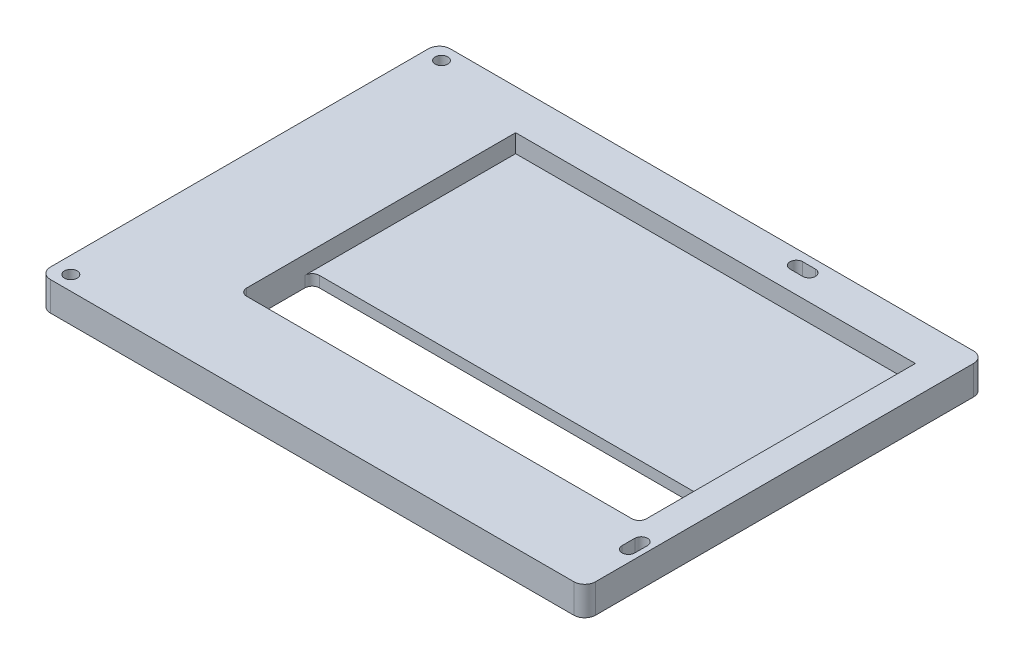
ISO-10303-21;
HEADER;
FILE_DESCRIPTION(('STEP AP214'),'2;1');
FILE_NAME('part.step','',(''),(''),'','','');
FILE_SCHEMA(('AUTOMOTIVE_DESIGN { 1 0 10303 214 1 1 1 1 }'));
ENDSEC;
DATA;
#1=APPLICATION_CONTEXT('core data for automotive mechanical design processes');
#2=APPLICATION_PROTOCOL_DEFINITION('international standard','automotive_design',2000,#1);
#3=PRODUCT_CONTEXT('',#1,'mechanical');
#4=PRODUCT('Part','Part','',(#3));
#5=PRODUCT_RELATED_PRODUCT_CATEGORY('part','',(#4));
#6=PRODUCT_DEFINITION_FORMATION('','',#4);
#7=PRODUCT_DEFINITION_CONTEXT('part definition',#1,'design');
#8=PRODUCT_DEFINITION('design','',#6,#7);
#9=PRODUCT_DEFINITION_SHAPE('','',#8);
#10=(LENGTH_UNIT() NAMED_UNIT(*) SI_UNIT(.MILLI.,.METRE.));
#11=(NAMED_UNIT(*) PLANE_ANGLE_UNIT() SI_UNIT($,.RADIAN.));
#12=(NAMED_UNIT(*) SI_UNIT($,.STERADIAN.) SOLID_ANGLE_UNIT());
#13=UNCERTAINTY_MEASURE_WITH_UNIT(LENGTH_MEASURE(1.E-05),#10,'distance_accuracy_value','');
#14=(GEOMETRIC_REPRESENTATION_CONTEXT(3) GLOBAL_UNCERTAINTY_ASSIGNED_CONTEXT((#13)) GLOBAL_UNIT_ASSIGNED_CONTEXT((#10,
#11,#12)) REPRESENTATION_CONTEXT('',''));
#15=CARTESIAN_POINT('',(0.,0.,0.));
#16=DIRECTION('',(0.,0.,1.));
#17=DIRECTION('',(1.,0.,0.));
#18=AXIS2_PLACEMENT_3D('',#15,#16,#17);
#19=CARTESIAN_POINT('',(0.,8.,0.));
#20=DIRECTION('',(1.,0.,0.));
#21=DIRECTION('',(0.,0.,-1.));
#22=AXIS2_PLACEMENT_3D('',#19,#20,#21);
#23=PLANE('',#22);
#24=DIRECTION('',(0.,0.,1.));
#25=VECTOR('',#24,1.);
#26=CARTESIAN_POINT('',(0.,8.,0.));
#27=LINE('',#26,#25);
#28=CARTESIAN_POINT('',(0.,8.,-107.));
#29=VERTEX_POINT('',#28);
#30=CARTESIAN_POINT('',(0.,8.,-3.));
#31=VERTEX_POINT('',#30);
#32=EDGE_CURVE('E387',#29,#31,#27,.T.);
#33=ORIENTED_EDGE('',*,*,#32,.F.);
#34=DIRECTION('',(0.,-1.,0.));
#35=VECTOR('',#34,1.);
#36=CARTESIAN_POINT('',(0.,8.,-107.));
#37=LINE('',#36,#35);
#38=CARTESIAN_POINT('',(0.,0.,-107.));
#39=VERTEX_POINT('',#38);
#40=EDGE_CURVE('E468',#29,#39,#37,.T.);
#41=ORIENTED_EDGE('',*,*,#40,.T.);
#42=DIRECTION('',(0.,0.,1.));
#43=VECTOR('',#42,1.);
#44=CARTESIAN_POINT('',(0.,0.,0.));
#45=LINE('',#44,#43);
#46=CARTESIAN_POINT('',(0.,0.,-3.));
#47=VERTEX_POINT('',#46);
#48=EDGE_CURVE('E383',#39,#47,#45,.T.);
#49=ORIENTED_EDGE('',*,*,#48,.T.);
#50=DIRECTION('',(0.,-1.,0.));
#51=VECTOR('',#50,1.);
#52=CARTESIAN_POINT('',(0.,8.,-3.));
#53=LINE('',#52,#51);
#54=EDGE_CURVE('E465',#47,#31,#53,.F.);
#55=ORIENTED_EDGE('',*,*,#54,.T.);
#56=EDGE_LOOP('',(#33,#41,#49,#55));
#57=FACE_BOUND('',#56,.T.);
#58=ADVANCED_FACE('F39',(#57),#23,.F.);
#59=CARTESIAN_POINT('',(0.,8.,0.));
#60=DIRECTION('',(0.,0.,-1.));
#61=DIRECTION('',(-1.,0.,0.));
#62=AXIS2_PLACEMENT_3D('',#59,#60,#61);
#63=PLANE('',#62);
#64=DIRECTION('',(1.,0.,0.));
#65=VECTOR('',#64,1.);
#66=CARTESIAN_POINT('',(0.,0.,0.));
#67=LINE('',#66,#65);
#68=CARTESIAN_POINT('',(3.,0.,0.));
#69=VERTEX_POINT('',#68);
#70=CARTESIAN_POINT('',(147.,0.,0.));
#71=VERTEX_POINT('',#70);
#72=EDGE_CURVE('E406',#69,#71,#67,.T.);
#73=ORIENTED_EDGE('',*,*,#72,.T.);
#74=DIRECTION('',(0.,-1.,0.));
#75=VECTOR('',#74,1.);
#76=CARTESIAN_POINT('',(147.,8.,0.));
#77=LINE('',#76,#75);
#78=CARTESIAN_POINT('',(147.,8.,0.));
#79=VERTEX_POINT('',#78);
#80=EDGE_CURVE('E11',#71,#79,#77,.F.);
#81=ORIENTED_EDGE('',*,*,#80,.T.);
#82=DIRECTION('',(1.,0.,0.));
#83=VECTOR('',#82,1.);
#84=CARTESIAN_POINT('',(0.,8.,0.));
#85=LINE('',#84,#83);
#86=CARTESIAN_POINT('',(3.,8.,0.));
#87=VERTEX_POINT('',#86);
#88=EDGE_CURVE('E391',#87,#79,#85,.T.);
#89=ORIENTED_EDGE('',*,*,#88,.F.);
#90=DIRECTION('',(0.,-1.,0.));
#91=VECTOR('',#90,1.);
#92=CARTESIAN_POINT('',(3.,8.,0.));
#93=LINE('',#92,#91);
#94=EDGE_CURVE('E48',#87,#69,#93,.T.);
#95=ORIENTED_EDGE('',*,*,#94,.T.);
#96=EDGE_LOOP('',(#73,#81,#89,#95));
#97=FACE_BOUND('',#96,.T.);
#98=ADVANCED_FACE('F513',(#97),#63,.F.);
#99=CARTESIAN_POINT('',(150.,8.,0.));
#100=DIRECTION('',(-1.,0.,0.));
#101=DIRECTION('',(0.,0.,1.));
#102=AXIS2_PLACEMENT_3D('',#99,#100,#101);
#103=PLANE('',#102);
#104=DIRECTION('',(0.,0.,-1.));
#105=VECTOR('',#104,1.);
#106=CARTESIAN_POINT('',(150.,0.,0.));
#107=LINE('',#106,#105);
#108=CARTESIAN_POINT('',(150.,0.,-3.));
#109=VERTEX_POINT('',#108);
#110=CARTESIAN_POINT('',(150.,0.,-107.));
#111=VERTEX_POINT('',#110);
#112=EDGE_CURVE('E410',#109,#111,#107,.T.);
#113=ORIENTED_EDGE('',*,*,#112,.T.);
#114=DIRECTION('',(0.,-1.,0.));
#115=VECTOR('',#114,1.);
#116=CARTESIAN_POINT('',(150.,8.,-107.));
#117=LINE('',#116,#115);
#118=CARTESIAN_POINT('',(150.,8.,-107.));
#119=VERTEX_POINT('',#118);
#120=EDGE_CURVE('E55',#111,#119,#117,.F.);
#121=ORIENTED_EDGE('',*,*,#120,.T.);
#122=DIRECTION('',(0.,0.,-1.));
#123=VECTOR('',#122,1.);
#124=CARTESIAN_POINT('',(150.,8.,0.));
#125=LINE('',#124,#123);
#126=CARTESIAN_POINT('',(150.,8.,-3.));
#127=VERTEX_POINT('',#126);
#128=EDGE_CURVE('E395',#127,#119,#125,.T.);
#129=ORIENTED_EDGE('',*,*,#128,.F.);
#130=DIRECTION('',(0.,-1.,0.));
#131=VECTOR('',#130,1.);
#132=CARTESIAN_POINT('',(150.,8.,-3.));
#133=LINE('',#132,#131);
#134=EDGE_CURVE('E502',#127,#109,#133,.T.);
#135=ORIENTED_EDGE('',*,*,#134,.T.);
#136=EDGE_LOOP('',(#113,#121,#129,#135));
#137=FACE_BOUND('',#136,.T.);
#138=ADVANCED_FACE('F524',(#137),#103,.F.);
#139=CARTESIAN_POINT('',(0.,8.,-110.));
#140=DIRECTION('',(0.,0.,1.));
#141=DIRECTION('',(1.,0.,0.));
#142=AXIS2_PLACEMENT_3D('',#139,#140,#141);
#143=PLANE('',#142);
#144=DIRECTION('',(-1.,0.,0.));
#145=VECTOR('',#144,1.);
#146=CARTESIAN_POINT('',(0.,0.,-110.));
#147=LINE('',#146,#145);
#148=CARTESIAN_POINT('',(147.,0.,-110.));
#149=VERTEX_POINT('',#148);
#150=CARTESIAN_POINT('',(3.,0.,-110.));
#151=VERTEX_POINT('',#150);
#152=EDGE_CURVE('E392',#149,#151,#147,.T.);
#153=ORIENTED_EDGE('',*,*,#152,.T.);
#154=DIRECTION('',(0.,-1.,0.));
#155=VECTOR('',#154,1.);
#156=CARTESIAN_POINT('',(3.,8.,-110.));
#157=LINE('',#156,#155);
#158=CARTESIAN_POINT('',(3.,8.,-110.));
#159=VERTEX_POINT('',#158);
#160=EDGE_CURVE('E488',#151,#159,#157,.F.);
#161=ORIENTED_EDGE('',*,*,#160,.T.);
#162=DIRECTION('',(-1.,0.,0.));
#163=VECTOR('',#162,1.);
#164=CARTESIAN_POINT('',(0.,8.,-110.));
#165=LINE('',#164,#163);
#166=CARTESIAN_POINT('',(147.,8.,-110.));
#167=VERTEX_POINT('',#166);
#168=EDGE_CURVE('E398',#167,#159,#165,.T.);
#169=ORIENTED_EDGE('',*,*,#168,.F.);
#170=DIRECTION('',(0.,-1.,0.));
#171=VECTOR('',#170,1.);
#172=CARTESIAN_POINT('',(147.,8.,-110.));
#173=LINE('',#172,#171);
#174=EDGE_CURVE('E484',#167,#149,#173,.T.);
#175=ORIENTED_EDGE('',*,*,#174,.T.);
#176=EDGE_LOOP('',(#153,#161,#169,#175));
#177=FACE_BOUND('',#176,.T.);
#178=ADVANCED_FACE('F533',(#177),#143,.F.);
#179=CARTESIAN_POINT('',(0.,8.,0.));
#180=DIRECTION('',(0.,-1.,0.));
#181=DIRECTION('',(0.,0.,-1.));
#182=AXIS2_PLACEMENT_3D('',#179,#180,#181);
#183=PLANE('',#182);
#184=DIRECTION('',(0.,0.,1.));
#185=VECTOR('',#184,1.);
#186=CARTESIAN_POINT('',(32.,8.,-43.));
#187=LINE('',#186,#185);
#188=CARTESIAN_POINT('',(32.,8.,-99.));
#189=VERTEX_POINT('',#188);
#190=CARTESIAN_POINT('',(32.,8.,-25.));
#191=VERTEX_POINT('',#190);
#192=EDGE_CURVE('E254',#189,#191,#187,.T.);
#193=ORIENTED_EDGE('',*,*,#192,.F.);
#194=DIRECTION('',(-1.,0.,0.));
#195=VECTOR('',#194,1.);
#196=CARTESIAN_POINT('',(32.,8.,-99.));
#197=LINE('',#196,#195);
#198=CARTESIAN_POINT('',(142.,8.,-99.));
#199=VERTEX_POINT('',#198);
#200=EDGE_CURVE('E245',#199,#189,#197,.T.);
#201=ORIENTED_EDGE('',*,*,#200,.F.);
#202=DIRECTION('',(0.,0.,-1.));
#203=VECTOR('',#202,1.);
#204=CARTESIAN_POINT('',(142.,8.,-43.));
#205=LINE('',#204,#203);
#206=CARTESIAN_POINT('',(142.,8.,-25.));
#207=VERTEX_POINT('',#206);
#208=EDGE_CURVE('E231',#207,#199,#205,.T.);
#209=ORIENTED_EDGE('',*,*,#208,.F.);
#210=CARTESIAN_POINT('',(140.,8.,-25.));
#211=DIRECTION('',(0.,-1.,0.));
#212=DIRECTION('',(0.,0.,-1.));
#213=AXIS2_PLACEMENT_3D('',#210,#211,#212);
#214=CIRCLE('',#213,2.);
#215=CARTESIAN_POINT('',(140.,8.,-23.));
#216=VERTEX_POINT('',#215);
#217=EDGE_CURVE('E453',#207,#216,#214,.T.);
#218=ORIENTED_EDGE('',*,*,#217,.T.);
#219=DIRECTION('',(1.,0.,0.));
#220=VECTOR('',#219,1.);
#221=CARTESIAN_POINT('',(32.,8.,-23.));
#222=LINE('',#221,#220);
#223=CARTESIAN_POINT('',(34.,8.,-23.));
#224=VERTEX_POINT('',#223);
#225=EDGE_CURVE('E275',#224,#216,#222,.T.);
#226=ORIENTED_EDGE('',*,*,#225,.F.);
#227=CARTESIAN_POINT('',(34.,8.,-25.));
#228=DIRECTION('',(0.,-1.,0.));
#229=DIRECTION('',(0.,0.,-1.));
#230=AXIS2_PLACEMENT_3D('',#227,#228,#229);
#231=CIRCLE('',#230,2.);
#232=EDGE_CURVE('E459',#224,#191,#231,.T.);
#233=ORIENTED_EDGE('',*,*,#232,.T.);
#234=EDGE_LOOP('',(#193,#201,#209,#218,#226,#233));
#235=FACE_BOUND('',#234,.T.);
#236=DIRECTION('',(0.,0.,-1.));
#237=VECTOR('',#236,1.);
#238=CARTESIAN_POINT('',(148.55,8.,-15.25));
#239=LINE('',#238,#237);
#240=CARTESIAN_POINT('',(148.55,8.,-15.25));
#241=VERTEX_POINT('',#240);
#242=CARTESIAN_POINT('',(148.55,8.,-18.75));
#243=VERTEX_POINT('',#242);
#244=EDGE_CURVE('E349',#241,#243,#239,.T.);
#245=ORIENTED_EDGE('',*,*,#244,.F.);
#246=CARTESIAN_POINT('',(146.8,8.,-15.25));
#247=DIRECTION('',(0.,1.,0.));
#248=DIRECTION('',(0.,0.,1.));
#249=AXIS2_PLACEMENT_3D('',#246,#247,#248);
#250=CIRCLE('',#249,1.75);
#251=CARTESIAN_POINT('',(145.05,8.,-15.25));
#252=VERTEX_POINT('',#251);
#253=EDGE_CURVE('E271',#252,#241,#250,.T.);
#254=ORIENTED_EDGE('',*,*,#253,.F.);
#255=DIRECTION('',(0.,0.,1.));
#256=VECTOR('',#255,1.);
#257=CARTESIAN_POINT('',(145.05,8.,-15.25));
#258=LINE('',#257,#256);
#259=CARTESIAN_POINT('',(145.05,8.,-18.75));
#260=VERTEX_POINT('',#259);
#261=EDGE_CURVE('E333',#260,#252,#258,.T.);
#262=ORIENTED_EDGE('',*,*,#261,.F.);
#263=CARTESIAN_POINT('',(146.8,8.,-18.75));
#264=DIRECTION('',(0.,1.,0.));
#265=DIRECTION('',(0.,0.,1.));
#266=AXIS2_PLACEMENT_3D('',#263,#264,#265);
#267=CIRCLE('',#266,1.75);
#268=EDGE_CURVE('E352',#243,#260,#267,.T.);
#269=ORIENTED_EDGE('',*,*,#268,.F.);
#270=EDGE_LOOP('',(#245,#254,#262,#269));
#271=FACE_BOUND('',#270,.T.);
#272=DIRECTION('',(1.,0.,0.));
#273=VECTOR('',#272,1.);
#274=CARTESIAN_POINT('',(102.25,8.,-104.25));
#275=LINE('',#274,#273);
#276=CARTESIAN_POINT('',(102.25,8.,-104.25));
#277=VERTEX_POINT('',#276);
#278=CARTESIAN_POINT('',(105.75,8.,-104.25));
#279=VERTEX_POINT('',#278);
#280=EDGE_CURVE('E302',#277,#279,#275,.T.);
#281=ORIENTED_EDGE('',*,*,#280,.F.);
#282=CARTESIAN_POINT('',(102.25,8.,-106.));
#283=DIRECTION('',(0.,1.,0.));
#284=DIRECTION('',(0.,0.,1.));
#285=AXIS2_PLACEMENT_3D('',#282,#283,#284);
#286=CIRCLE('',#285,1.75);
#287=CARTESIAN_POINT('',(102.25,8.,-107.75));
#288=VERTEX_POINT('',#287);
#289=EDGE_CURVE('E299',#288,#277,#286,.T.);
#290=ORIENTED_EDGE('',*,*,#289,.F.);
#291=DIRECTION('',(-1.,0.,0.));
#292=VECTOR('',#291,1.);
#293=CARTESIAN_POINT('',(102.25,8.,-107.75));
#294=LINE('',#293,#292);
#295=CARTESIAN_POINT('',(105.75,8.,-107.75));
#296=VERTEX_POINT('',#295);
#297=EDGE_CURVE('E286',#296,#288,#294,.T.);
#298=ORIENTED_EDGE('',*,*,#297,.F.);
#299=CARTESIAN_POINT('',(105.75,8.,-106.));
#300=DIRECTION('',(0.,1.,0.));
#301=DIRECTION('',(0.,0.,1.));
#302=AXIS2_PLACEMENT_3D('',#299,#300,#301);
#303=CIRCLE('',#302,1.75);
#304=EDGE_CURVE('E306',#279,#296,#303,.T.);
#305=ORIENTED_EDGE('',*,*,#304,.F.);
#306=EDGE_LOOP('',(#281,#290,#298,#305));
#307=FACE_BOUND('',#306,.T.);
#308=CARTESIAN_POINT('',(4.6,8.,-4.));
#309=DIRECTION('',(0.,1.,0.));
#310=DIRECTION('',(0.,0.,1.));
#311=AXIS2_PLACEMENT_3D('',#308,#309,#310);
#312=CIRCLE('',#311,1.75);
#313=CARTESIAN_POINT('',(4.6,8.,-2.25));
#314=VERTEX_POINT('',#313);
#315=EDGE_CURVE('E316',#314,#314,#312,.T.);
#316=ORIENTED_EDGE('',*,*,#315,.F.);
#317=EDGE_LOOP('',(#316));
#318=FACE_BOUND('',#317,.T.);
#319=CARTESIAN_POINT('',(4.6,8.,-106.));
#320=DIRECTION('',(0.,1.,0.));
#321=DIRECTION('',(0.,0.,1.));
#322=AXIS2_PLACEMENT_3D('',#319,#320,#321);
#323=CIRCLE('',#322,1.75);
#324=CARTESIAN_POINT('',(4.6,8.,-104.25));
#325=VERTEX_POINT('',#324);
#326=EDGE_CURVE('E375',#325,#325,#323,.T.);
#327=ORIENTED_EDGE('',*,*,#326,.F.);
#328=EDGE_LOOP('',(#327));
#329=FACE_BOUND('',#328,.T.);
#330=ORIENTED_EDGE('',*,*,#168,.T.);
#331=CARTESIAN_POINT('',(3.,8.,-107.));
#332=DIRECTION('',(0.,-1.,0.));
#333=DIRECTION('',(0.,0.,-1.));
#334=AXIS2_PLACEMENT_3D('',#331,#332,#333);
#335=CIRCLE('',#334,3.);
#336=EDGE_CURVE('E499',#159,#29,#335,.F.);
#337=ORIENTED_EDGE('',*,*,#336,.T.);
#338=ORIENTED_EDGE('',*,*,#32,.T.);
#339=CARTESIAN_POINT('',(3.,8.,-3.));
#340=DIRECTION('',(0.,-1.,0.));
#341=DIRECTION('',(0.,0.,-1.));
#342=AXIS2_PLACEMENT_3D('',#339,#340,#341);
#343=CIRCLE('',#342,3.);
#344=EDGE_CURVE('E491',#31,#87,#343,.F.);
#345=ORIENTED_EDGE('',*,*,#344,.T.);
#346=ORIENTED_EDGE('',*,*,#88,.T.);
#347=CARTESIAN_POINT('',(147.,8.,-3.));
#348=DIRECTION('',(0.,-1.,0.));
#349=DIRECTION('',(0.,0.,-1.));
#350=AXIS2_PLACEMENT_3D('',#347,#348,#349);
#351=CIRCLE('',#350,3.);
#352=EDGE_CURVE('E62',#79,#127,#351,.F.);
#353=ORIENTED_EDGE('',*,*,#352,.T.);
#354=ORIENTED_EDGE('',*,*,#128,.T.);
#355=CARTESIAN_POINT('',(147.,8.,-107.));
#356=DIRECTION('',(0.,-1.,0.));
#357=DIRECTION('',(0.,0.,-1.));
#358=AXIS2_PLACEMENT_3D('',#355,#356,#357);
#359=CIRCLE('',#358,3.);
#360=EDGE_CURVE('E496',#119,#167,#359,.F.);
#361=ORIENTED_EDGE('',*,*,#360,.T.);
#362=EDGE_LOOP('',(#330,#337,#338,#345,#346,#353,#354,#361));
#363=FACE_BOUND('',#362,.T.);
#364=ADVANCED_FACE('F526',(#235,#271,#307,#318,#329,#363),#183,.F.);
#365=CARTESIAN_POINT('',(0.,0.,0.));
#366=DIRECTION('',(0.,-1.,0.));
#367=DIRECTION('',(0.,0.,-1.));
#368=AXIS2_PLACEMENT_3D('',#365,#366,#367);
#369=PLANE('',#368);
#370=DIRECTION('',(-1.,0.,0.));
#371=VECTOR('',#370,1.);
#372=CARTESIAN_POINT('',(32.,0.,-43.));
#373=LINE('',#372,#371);
#374=CARTESIAN_POINT('',(140.,0.,-43.));
#375=VERTEX_POINT('',#374);
#376=CARTESIAN_POINT('',(34.,0.,-43.));
#377=VERTEX_POINT('',#376);
#378=EDGE_CURVE('E267',#375,#377,#373,.T.);
#379=ORIENTED_EDGE('',*,*,#378,.T.);
#380=CARTESIAN_POINT('',(34.,0.,-41.));
#381=DIRECTION('',(0.,-1.,0.));
#382=DIRECTION('',(0.,0.,-1.));
#383=AXIS2_PLACEMENT_3D('',#380,#381,#382);
#384=CIRCLE('',#383,2.);
#385=CARTESIAN_POINT('',(32.,0.,-41.));
#386=VERTEX_POINT('',#385);
#387=EDGE_CURVE('E450',#377,#386,#384,.F.);
#388=ORIENTED_EDGE('',*,*,#387,.T.);
#389=DIRECTION('',(0.,0.,1.));
#390=VECTOR('',#389,1.);
#391=CARTESIAN_POINT('',(32.,0.,-43.));
#392=LINE('',#391,#390);
#393=CARTESIAN_POINT('',(32.,0.,-25.));
#394=VERTEX_POINT('',#393);
#395=EDGE_CURVE('E255',#386,#394,#392,.T.);
#396=ORIENTED_EDGE('',*,*,#395,.T.);
#397=CARTESIAN_POINT('',(34.,0.,-25.));
#398=DIRECTION('',(0.,-1.,0.));
#399=DIRECTION('',(0.,0.,-1.));
#400=AXIS2_PLACEMENT_3D('',#397,#398,#399);
#401=CIRCLE('',#400,2.);
#402=CARTESIAN_POINT('',(34.,0.,-23.));
#403=VERTEX_POINT('',#402);
#404=EDGE_CURVE('E462',#394,#403,#401,.F.);
#405=ORIENTED_EDGE('',*,*,#404,.T.);
#406=DIRECTION('',(1.,0.,0.));
#407=VECTOR('',#406,1.);
#408=CARTESIAN_POINT('',(32.,0.,-23.));
#409=LINE('',#408,#407);
#410=CARTESIAN_POINT('',(140.,0.,-23.));
#411=VERTEX_POINT('',#410);
#412=EDGE_CURVE('E259',#403,#411,#409,.T.);
#413=ORIENTED_EDGE('',*,*,#412,.T.);
#414=CARTESIAN_POINT('',(140.,0.,-25.));
#415=DIRECTION('',(0.,-1.,0.));
#416=DIRECTION('',(0.,0.,-1.));
#417=AXIS2_PLACEMENT_3D('',#414,#415,#416);
#418=CIRCLE('',#417,2.);
#419=CARTESIAN_POINT('',(142.,0.,-25.));
#420=VERTEX_POINT('',#419);
#421=EDGE_CURVE('E456',#411,#420,#418,.F.);
#422=ORIENTED_EDGE('',*,*,#421,.T.);
#423=DIRECTION('',(0.,0.,-1.));
#424=VECTOR('',#423,1.);
#425=CARTESIAN_POINT('',(142.,0.,-43.));
#426=LINE('',#425,#424);
#427=CARTESIAN_POINT('',(142.,0.,-41.));
#428=VERTEX_POINT('',#427);
#429=EDGE_CURVE('E263',#420,#428,#426,.T.);
#430=ORIENTED_EDGE('',*,*,#429,.T.);
#431=CARTESIAN_POINT('',(140.,0.,-41.));
#432=DIRECTION('',(0.,-1.,0.));
#433=DIRECTION('',(0.,0.,-1.));
#434=AXIS2_PLACEMENT_3D('',#431,#432,#433);
#435=CIRCLE('',#434,2.);
#436=EDGE_CURVE('E444',#428,#375,#435,.F.);
#437=ORIENTED_EDGE('',*,*,#436,.T.);
#438=EDGE_LOOP('',(#379,#388,#396,#405,#413,#422,#430,#437));
#439=FACE_BOUND('',#438,.T.);
#440=CARTESIAN_POINT('',(102.25,0.,-106.));
#441=DIRECTION('',(0.,1.,0.));
#442=DIRECTION('',(0.,0.,1.));
#443=AXIS2_PLACEMENT_3D('',#440,#441,#442);
#444=CIRCLE('',#443,1.75);
#445=CARTESIAN_POINT('',(102.25,0.,-107.75));
#446=VERTEX_POINT('',#445);
#447=CARTESIAN_POINT('',(102.25,0.,-104.25));
#448=VERTEX_POINT('',#447);
#449=EDGE_CURVE('E281',#446,#448,#444,.T.);
#450=ORIENTED_EDGE('',*,*,#449,.T.);
#451=DIRECTION('',(1.,0.,0.));
#452=VECTOR('',#451,1.);
#453=CARTESIAN_POINT('',(102.25,0.,-104.25));
#454=LINE('',#453,#452);
#455=CARTESIAN_POINT('',(105.75,0.,-104.25));
#456=VERTEX_POINT('',#455);
#457=EDGE_CURVE('E285',#448,#456,#454,.T.);
#458=ORIENTED_EDGE('',*,*,#457,.T.);
#459=CARTESIAN_POINT('',(105.75,0.,-106.));
#460=DIRECTION('',(0.,1.,0.));
#461=DIRECTION('',(0.,0.,1.));
#462=AXIS2_PLACEMENT_3D('',#459,#460,#461);
#463=CIRCLE('',#462,1.75);
#464=CARTESIAN_POINT('',(105.75,0.,-107.75));
#465=VERTEX_POINT('',#464);
#466=EDGE_CURVE('E290',#456,#465,#463,.T.);
#467=ORIENTED_EDGE('',*,*,#466,.T.);
#468=DIRECTION('',(-1.,0.,0.));
#469=VECTOR('',#468,1.);
#470=CARTESIAN_POINT('',(102.25,0.,-107.75));
#471=LINE('',#470,#469);
#472=EDGE_CURVE('E294',#465,#446,#471,.T.);
#473=ORIENTED_EDGE('',*,*,#472,.T.);
#474=EDGE_LOOP('',(#450,#458,#467,#473));
#475=FACE_BOUND('',#474,.T.);
#476=CARTESIAN_POINT('',(146.8,0.,-15.25));
#477=DIRECTION('',(0.,1.,0.));
#478=DIRECTION('',(0.,0.,1.));
#479=AXIS2_PLACEMENT_3D('',#476,#477,#478);
#480=CIRCLE('',#479,1.75);
#481=CARTESIAN_POINT('',(145.05,0.,-15.25));
#482=VERTEX_POINT('',#481);
#483=CARTESIAN_POINT('',(148.55,0.,-15.25));
#484=VERTEX_POINT('',#483);
#485=EDGE_CURVE('E328',#482,#484,#480,.T.);
#486=ORIENTED_EDGE('',*,*,#485,.T.);
#487=DIRECTION('',(0.,0.,-1.));
#488=VECTOR('',#487,1.);
#489=CARTESIAN_POINT('',(148.55,0.,-15.25));
#490=LINE('',#489,#488);
#491=CARTESIAN_POINT('',(148.55,0.,-18.75));
#492=VERTEX_POINT('',#491);
#493=EDGE_CURVE('E332',#484,#492,#490,.T.);
#494=ORIENTED_EDGE('',*,*,#493,.T.);
#495=CARTESIAN_POINT('',(146.8,0.,-18.75));
#496=DIRECTION('',(0.,1.,0.));
#497=DIRECTION('',(0.,0.,1.));
#498=AXIS2_PLACEMENT_3D('',#495,#496,#497);
#499=CIRCLE('',#498,1.75);
#500=CARTESIAN_POINT('',(145.05,0.,-18.75));
#501=VERTEX_POINT('',#500);
#502=EDGE_CURVE('E337',#492,#501,#499,.T.);
#503=ORIENTED_EDGE('',*,*,#502,.T.);
#504=DIRECTION('',(0.,0.,1.));
#505=VECTOR('',#504,1.);
#506=CARTESIAN_POINT('',(145.05,0.,-15.25));
#507=LINE('',#506,#505);
#508=EDGE_CURVE('E341',#501,#482,#507,.T.);
#509=ORIENTED_EDGE('',*,*,#508,.T.);
#510=EDGE_LOOP('',(#486,#494,#503,#509));
#511=FACE_BOUND('',#510,.T.);
#512=CARTESIAN_POINT('',(4.6,0.,-4.));
#513=DIRECTION('',(0.,1.,0.));
#514=DIRECTION('',(0.,0.,1.));
#515=AXIS2_PLACEMENT_3D('',#512,#513,#514);
#516=CIRCLE('',#515,1.75);
#517=CARTESIAN_POINT('',(4.6,0.,-2.25));
#518=VERTEX_POINT('',#517);
#519=EDGE_CURVE('E371',#518,#518,#516,.T.);
#520=ORIENTED_EDGE('',*,*,#519,.T.);
#521=EDGE_LOOP('',(#520));
#522=FACE_BOUND('',#521,.T.);
#523=CARTESIAN_POINT('',(4.6,0.,-106.));
#524=DIRECTION('',(0.,1.,0.));
#525=DIRECTION('',(0.,0.,1.));
#526=AXIS2_PLACEMENT_3D('',#523,#524,#525);
#527=CIRCLE('',#526,1.75);
#528=CARTESIAN_POINT('',(4.6,0.,-104.25));
#529=VERTEX_POINT('',#528);
#530=EDGE_CURVE('E379',#529,#529,#527,.T.);
#531=ORIENTED_EDGE('',*,*,#530,.T.);
#532=EDGE_LOOP('',(#531));
#533=FACE_BOUND('',#532,.T.);
#534=ORIENTED_EDGE('',*,*,#48,.F.);
#535=CARTESIAN_POINT('',(3.,0.,-107.));
#536=DIRECTION('',(0.,-1.,0.));
#537=DIRECTION('',(0.,0.,-1.));
#538=AXIS2_PLACEMENT_3D('',#535,#536,#537);
#539=CIRCLE('',#538,3.);
#540=EDGE_CURVE('E481',#39,#151,#539,.T.);
#541=ORIENTED_EDGE('',*,*,#540,.T.);
#542=ORIENTED_EDGE('',*,*,#152,.F.);
#543=CARTESIAN_POINT('',(147.,0.,-107.));
#544=DIRECTION('',(0.,-1.,0.));
#545=DIRECTION('',(0.,0.,-1.));
#546=AXIS2_PLACEMENT_3D('',#543,#544,#545);
#547=CIRCLE('',#546,3.);
#548=EDGE_CURVE('E478',#149,#111,#547,.T.);
#549=ORIENTED_EDGE('',*,*,#548,.T.);
#550=ORIENTED_EDGE('',*,*,#112,.F.);
#551=CARTESIAN_POINT('',(147.,0.,-3.));
#552=DIRECTION('',(0.,-1.,0.));
#553=DIRECTION('',(0.,0.,-1.));
#554=AXIS2_PLACEMENT_3D('',#551,#552,#553);
#555=CIRCLE('',#554,3.);
#556=EDGE_CURVE('E475',#109,#71,#555,.T.);
#557=ORIENTED_EDGE('',*,*,#556,.T.);
#558=ORIENTED_EDGE('',*,*,#72,.F.);
#559=CARTESIAN_POINT('',(3.,0.,-3.));
#560=DIRECTION('',(0.,-1.,0.));
#561=DIRECTION('',(0.,0.,-1.));
#562=AXIS2_PLACEMENT_3D('',#559,#560,#561);
#563=CIRCLE('',#562,3.);
#564=EDGE_CURVE('E472',#69,#47,#563,.T.);
#565=ORIENTED_EDGE('',*,*,#564,.T.);
#566=EDGE_LOOP('',(#534,#541,#542,#549,#550,#557,#558,#565));
#567=FACE_BOUND('',#566,.T.);
#568=ADVANCED_FACE('F519',(#439,#475,#511,#522,#533,#567),#369,.T.);
#569=CARTESIAN_POINT('',(4.6,0.,-106.));
#570=DIRECTION('',(0.,1.,0.));
#571=DIRECTION('',(0.,0.,1.));
#572=AXIS2_PLACEMENT_3D('',#569,#570,#571);
#573=CYLINDRICAL_SURFACE('',#572,1.75);
#574=ORIENTED_EDGE('',*,*,#530,.F.);
#575=EDGE_LOOP('',(#574));
#576=FACE_BOUND('',#575,.T.);
#577=ORIENTED_EDGE('',*,*,#326,.T.);
#578=EDGE_LOOP('',(#577));
#579=FACE_BOUND('',#578,.T.);
#580=ADVANCED_FACE('F747',(#576,#579),#573,.F.);
#581=CARTESIAN_POINT('',(4.6,0.,-4.));
#582=DIRECTION('',(0.,1.,0.));
#583=DIRECTION('',(0.,0.,1.));
#584=AXIS2_PLACEMENT_3D('',#581,#582,#583);
#585=CYLINDRICAL_SURFACE('',#584,1.75);
#586=ORIENTED_EDGE('',*,*,#519,.F.);
#587=EDGE_LOOP('',(#586));
#588=FACE_BOUND('',#587,.T.);
#589=ORIENTED_EDGE('',*,*,#315,.T.);
#590=EDGE_LOOP('',(#589));
#591=FACE_BOUND('',#590,.T.);
#592=ADVANCED_FACE('F739',(#588,#591),#585,.F.);
#593=CARTESIAN_POINT('',(145.05,0.,-15.25));
#594=DIRECTION('',(-1.,0.,0.));
#595=DIRECTION('',(0.,0.,1.));
#596=AXIS2_PLACEMENT_3D('',#593,#594,#595);
#597=PLANE('',#596);
#598=ORIENTED_EDGE('',*,*,#261,.T.);
#599=DIRECTION('',(0.,1.,0.));
#600=VECTOR('',#599,1.);
#601=CARTESIAN_POINT('',(145.05,0.,-15.25));
#602=LINE('',#601,#600);
#603=EDGE_CURVE('E303',#482,#252,#602,.T.);
#604=ORIENTED_EDGE('',*,*,#603,.F.);
#605=ORIENTED_EDGE('',*,*,#508,.F.);
#606=DIRECTION('',(0.,1.,0.));
#607=VECTOR('',#606,1.);
#608=CARTESIAN_POINT('',(145.05,0.,-18.75));
#609=LINE('',#608,#607);
#610=EDGE_CURVE('E361',#501,#260,#609,.T.);
#611=ORIENTED_EDGE('',*,*,#610,.T.);
#612=EDGE_LOOP('',(#598,#604,#605,#611));
#613=FACE_BOUND('',#612,.T.);
#614=ADVANCED_FACE('F731',(#613),#597,.F.);
#615=CARTESIAN_POINT('',(148.55,0.,-15.25));
#616=DIRECTION('',(1.,0.,0.));
#617=DIRECTION('',(0.,0.,-1.));
#618=AXIS2_PLACEMENT_3D('',#615,#616,#617);
#619=PLANE('',#618);
#620=ORIENTED_EDGE('',*,*,#244,.T.);
#621=DIRECTION('',(0.,1.,0.));
#622=VECTOR('',#621,1.);
#623=CARTESIAN_POINT('',(148.55,0.,-18.75));
#624=LINE('',#623,#622);
#625=EDGE_CURVE('E364',#492,#243,#624,.T.);
#626=ORIENTED_EDGE('',*,*,#625,.F.);
#627=ORIENTED_EDGE('',*,*,#493,.F.);
#628=DIRECTION('',(0.,1.,0.));
#629=VECTOR('',#628,1.);
#630=CARTESIAN_POINT('',(148.55,0.,-15.25));
#631=LINE('',#630,#629);
#632=EDGE_CURVE('E345',#484,#241,#631,.T.);
#633=ORIENTED_EDGE('',*,*,#632,.T.);
#634=EDGE_LOOP('',(#620,#626,#627,#633));
#635=FACE_BOUND('',#634,.T.);
#636=ADVANCED_FACE('F723',(#635),#619,.F.);
#637=CARTESIAN_POINT('',(146.8,0.,-15.25));
#638=DIRECTION('',(0.,1.,0.));
#639=DIRECTION('',(0.,0.,1.));
#640=AXIS2_PLACEMENT_3D('',#637,#638,#639);
#641=CYLINDRICAL_SURFACE('',#640,1.75);
#642=ORIENTED_EDGE('',*,*,#253,.T.);
#643=ORIENTED_EDGE('',*,*,#632,.F.);
#644=ORIENTED_EDGE('',*,*,#485,.F.);
#645=ORIENTED_EDGE('',*,*,#603,.T.);
#646=EDGE_LOOP('',(#642,#643,#644,#645));
#647=FACE_BOUND('',#646,.T.);
#648=ADVANCED_FACE('F715',(#647),#641,.F.);
#649=CARTESIAN_POINT('',(146.8,0.,-18.75));
#650=DIRECTION('',(0.,1.,0.));
#651=DIRECTION('',(0.,0.,1.));
#652=AXIS2_PLACEMENT_3D('',#649,#650,#651);
#653=CYLINDRICAL_SURFACE('',#652,1.75);
#654=ORIENTED_EDGE('',*,*,#268,.T.);
#655=ORIENTED_EDGE('',*,*,#610,.F.);
#656=ORIENTED_EDGE('',*,*,#502,.F.);
#657=ORIENTED_EDGE('',*,*,#625,.T.);
#658=EDGE_LOOP('',(#654,#655,#656,#657));
#659=FACE_BOUND('',#658,.T.);
#660=ADVANCED_FACE('F707',(#659),#653,.F.);
#661=CARTESIAN_POINT('',(102.25,0.,-107.75));
#662=DIRECTION('',(0.,0.,-1.));
#663=DIRECTION('',(-1.,0.,0.));
#664=AXIS2_PLACEMENT_3D('',#661,#662,#663);
#665=PLANE('',#664);
#666=ORIENTED_EDGE('',*,*,#297,.T.);
#667=DIRECTION('',(0.,1.,0.));
#668=VECTOR('',#667,1.);
#669=CARTESIAN_POINT('',(102.25,0.,-107.75));
#670=LINE('',#669,#668);
#671=EDGE_CURVE('E312',#446,#288,#670,.T.);
#672=ORIENTED_EDGE('',*,*,#671,.F.);
#673=ORIENTED_EDGE('',*,*,#472,.F.);
#674=DIRECTION('',(0.,1.,0.));
#675=VECTOR('',#674,1.);
#676=CARTESIAN_POINT('',(105.75,0.,-107.75));
#677=LINE('',#676,#675);
#678=EDGE_CURVE('E317',#465,#296,#677,.T.);
#679=ORIENTED_EDGE('',*,*,#678,.T.);
#680=EDGE_LOOP('',(#666,#672,#673,#679));
#681=FACE_BOUND('',#680,.T.);
#682=ADVANCED_FACE('F699',(#681),#665,.F.);
#683=CARTESIAN_POINT('',(102.25,0.,-104.25));
#684=DIRECTION('',(0.,0.,1.));
#685=DIRECTION('',(1.,0.,0.));
#686=AXIS2_PLACEMENT_3D('',#683,#684,#685);
#687=PLANE('',#686);
#688=ORIENTED_EDGE('',*,*,#280,.T.);
#689=DIRECTION('',(0.,1.,0.));
#690=VECTOR('',#689,1.);
#691=CARTESIAN_POINT('',(105.75,0.,-104.25));
#692=LINE('',#691,#690);
#693=EDGE_CURVE('E321',#456,#279,#692,.T.);
#694=ORIENTED_EDGE('',*,*,#693,.F.);
#695=ORIENTED_EDGE('',*,*,#457,.F.);
#696=DIRECTION('',(0.,1.,0.));
#697=VECTOR('',#696,1.);
#698=CARTESIAN_POINT('',(102.25,0.,-104.25));
#699=LINE('',#698,#697);
#700=EDGE_CURVE('E298',#448,#277,#699,.T.);
#701=ORIENTED_EDGE('',*,*,#700,.T.);
#702=EDGE_LOOP('',(#688,#694,#695,#701));
#703=FACE_BOUND('',#702,.T.);
#704=ADVANCED_FACE('F691',(#703),#687,.F.);
#705=CARTESIAN_POINT('',(102.25,0.,-106.));
#706=DIRECTION('',(0.,1.,0.));
#707=DIRECTION('',(0.,0.,1.));
#708=AXIS2_PLACEMENT_3D('',#705,#706,#707);
#709=CYLINDRICAL_SURFACE('',#708,1.75);
#710=ORIENTED_EDGE('',*,*,#289,.T.);
#711=ORIENTED_EDGE('',*,*,#700,.F.);
#712=ORIENTED_EDGE('',*,*,#449,.F.);
#713=ORIENTED_EDGE('',*,*,#671,.T.);
#714=EDGE_LOOP('',(#710,#711,#712,#713));
#715=FACE_BOUND('',#714,.T.);
#716=ADVANCED_FACE('F684',(#715),#709,.F.);
#717=CARTESIAN_POINT('',(105.75,0.,-106.));
#718=DIRECTION('',(0.,1.,0.));
#719=DIRECTION('',(0.,0.,1.));
#720=AXIS2_PLACEMENT_3D('',#717,#718,#719);
#721=CYLINDRICAL_SURFACE('',#720,1.75);
#722=ORIENTED_EDGE('',*,*,#304,.T.);
#723=ORIENTED_EDGE('',*,*,#678,.F.);
#724=ORIENTED_EDGE('',*,*,#466,.F.);
#725=ORIENTED_EDGE('',*,*,#693,.T.);
#726=EDGE_LOOP('',(#722,#723,#724,#725));
#727=FACE_BOUND('',#726,.T.);
#728=ADVANCED_FACE('F654',(#727),#721,.F.);
#729=CARTESIAN_POINT('',(32.,0.,-43.));
#730=DIRECTION('',(-1.,0.,0.));
#731=DIRECTION('',(0.,0.,1.));
#732=AXIS2_PLACEMENT_3D('',#729,#730,#731);
#733=PLANE('',#732);
#734=ORIENTED_EDGE('',*,*,#395,.F.);
#735=DIRECTION('',(0.,1.,0.));
#736=VECTOR('',#735,1.);
#737=CARTESIAN_POINT('',(32.,3.,-41.));
#738=LINE('',#737,#736);
#739=CARTESIAN_POINT('',(32.,3.,-41.));
#740=VERTEX_POINT('',#739);
#741=EDGE_CURVE('E431',#386,#740,#738,.T.);
#742=ORIENTED_EDGE('',*,*,#741,.T.);
#743=DIRECTION('',(0.,0.,1.));
#744=VECTOR('',#743,1.);
#745=CARTESIAN_POINT('',(32.,3.,-23.));
#746=LINE('',#745,#744);
#747=CARTESIAN_POINT('',(32.,3.,-99.));
#748=VERTEX_POINT('',#747);
#749=EDGE_CURVE('E224',#748,#740,#746,.T.);
#750=ORIENTED_EDGE('',*,*,#749,.F.);
#751=DIRECTION('',(0.,1.,0.));
#752=VECTOR('',#751,1.);
#753=CARTESIAN_POINT('',(32.,3.,-99.));
#754=LINE('',#753,#752);
#755=EDGE_CURVE('E236',#748,#189,#754,.T.);
#756=ORIENTED_EDGE('',*,*,#755,.T.);
#757=ORIENTED_EDGE('',*,*,#192,.T.);
#758=DIRECTION('',(0.,1.,0.));
#759=VECTOR('',#758,1.);
#760=CARTESIAN_POINT('',(32.,0.,-25.));
#761=LINE('',#760,#759);
#762=EDGE_CURVE('E428',#191,#394,#761,.F.);
#763=ORIENTED_EDGE('',*,*,#762,.T.);
#764=EDGE_LOOP('',(#734,#742,#750,#756,#757,#763));
#765=FACE_BOUND('',#764,.T.);
#766=ADVANCED_FACE('F649',(#765),#733,.F.);
#767=CARTESIAN_POINT('',(32.,0.,-43.));
#768=DIRECTION('',(0.,0.,-1.));
#769=DIRECTION('',(-1.,0.,0.));
#770=AXIS2_PLACEMENT_3D('',#767,#768,#769);
#771=PLANE('',#770);
#772=ORIENTED_EDGE('',*,*,#378,.F.);
#773=DIRECTION('',(0.,1.,0.));
#774=VECTOR('',#773,1.);
#775=CARTESIAN_POINT('',(140.,3.,-43.));
#776=LINE('',#775,#774);
#777=CARTESIAN_POINT('',(140.,3.,-43.));
#778=VERTEX_POINT('',#777);
#779=EDGE_CURVE('E418',#375,#778,#776,.T.);
#780=ORIENTED_EDGE('',*,*,#779,.T.);
#781=DIRECTION('',(-1.,0.,0.));
#782=VECTOR('',#781,1.);
#783=CARTESIAN_POINT('',(32.,3.,-43.));
#784=LINE('',#783,#782);
#785=CARTESIAN_POINT('',(34.,3.,-43.));
#786=VERTEX_POINT('',#785);
#787=EDGE_CURVE('E249',#778,#786,#784,.T.);
#788=ORIENTED_EDGE('',*,*,#787,.T.);
#789=DIRECTION('',(0.,1.,0.));
#790=VECTOR('',#789,1.);
#791=CARTESIAN_POINT('',(34.,0.,-43.));
#792=LINE('',#791,#790);
#793=EDGE_CURVE('E402',#786,#377,#792,.F.);
#794=ORIENTED_EDGE('',*,*,#793,.T.);
#795=EDGE_LOOP('',(#772,#780,#788,#794));
#796=FACE_BOUND('',#795,.T.);
#797=ADVANCED_FACE('F641',(#796),#771,.F.);
#798=CARTESIAN_POINT('',(142.,0.,-43.));
#799=DIRECTION('',(1.,0.,0.));
#800=DIRECTION('',(0.,0.,-1.));
#801=AXIS2_PLACEMENT_3D('',#798,#799,#800);
#802=PLANE('',#801);
#803=DIRECTION('',(0.,0.,-1.));
#804=VECTOR('',#803,1.);
#805=CARTESIAN_POINT('',(142.,3.,-23.));
#806=LINE('',#805,#804);
#807=CARTESIAN_POINT('',(142.,3.,-41.));
#808=VERTEX_POINT('',#807);
#809=CARTESIAN_POINT('',(142.,3.,-99.));
#810=VERTEX_POINT('',#809);
#811=EDGE_CURVE('E214',#808,#810,#806,.T.);
#812=ORIENTED_EDGE('',*,*,#811,.F.);
#813=DIRECTION('',(0.,1.,0.));
#814=VECTOR('',#813,1.);
#815=CARTESIAN_POINT('',(142.,0.,-41.));
#816=LINE('',#815,#814);
#817=EDGE_CURVE('E425',#808,#428,#816,.F.);
#818=ORIENTED_EDGE('',*,*,#817,.T.);
#819=ORIENTED_EDGE('',*,*,#429,.F.);
#820=DIRECTION('',(0.,1.,0.));
#821=VECTOR('',#820,1.);
#822=CARTESIAN_POINT('',(142.,8.,-25.));
#823=LINE('',#822,#821);
#824=EDGE_CURVE('E422',#420,#207,#823,.T.);
#825=ORIENTED_EDGE('',*,*,#824,.T.);
#826=ORIENTED_EDGE('',*,*,#208,.T.);
#827=DIRECTION('',(0.,1.,0.));
#828=VECTOR('',#827,1.);
#829=CARTESIAN_POINT('',(142.,3.,-99.));
#830=LINE('',#829,#828);
#831=EDGE_CURVE('E227',#810,#199,#830,.T.);
#832=ORIENTED_EDGE('',*,*,#831,.F.);
#833=EDGE_LOOP('',(#812,#818,#819,#825,#826,#832));
#834=FACE_BOUND('',#833,.T.);
#835=ADVANCED_FACE('F228',(#834),#802,.F.);
#836=CARTESIAN_POINT('',(32.,0.,-23.));
#837=DIRECTION('',(0.,0.,1.));
#838=DIRECTION('',(1.,0.,0.));
#839=AXIS2_PLACEMENT_3D('',#836,#837,#838);
#840=PLANE('',#839);
#841=ORIENTED_EDGE('',*,*,#225,.T.);
#842=DIRECTION('',(0.,1.,0.));
#843=VECTOR('',#842,1.);
#844=CARTESIAN_POINT('',(140.,0.,-23.));
#845=LINE('',#844,#843);
#846=EDGE_CURVE('E439',#216,#411,#845,.F.);
#847=ORIENTED_EDGE('',*,*,#846,.T.);
#848=ORIENTED_EDGE('',*,*,#412,.F.);
#849=DIRECTION('',(0.,1.,0.));
#850=VECTOR('',#849,1.);
#851=CARTESIAN_POINT('',(34.,8.,-23.));
#852=LINE('',#851,#850);
#853=EDGE_CURVE('E435',#403,#224,#852,.T.);
#854=ORIENTED_EDGE('',*,*,#853,.T.);
#855=EDGE_LOOP('',(#841,#847,#848,#854));
#856=FACE_BOUND('',#855,.T.);
#857=ADVANCED_FACE('F631',(#856),#840,.F.);
#858=CARTESIAN_POINT('',(0.,3.,0.));
#859=DIRECTION('',(0.,-1.,0.));
#860=DIRECTION('',(0.,0.,-1.));
#861=AXIS2_PLACEMENT_3D('',#858,#859,#860);
#862=PLANE('',#861);
#863=ORIENTED_EDGE('',*,*,#811,.T.);
#864=DIRECTION('',(-1.,0.,0.));
#865=VECTOR('',#864,1.);
#866=CARTESIAN_POINT('',(32.,3.,-99.));
#867=LINE('',#866,#865);
#868=EDGE_CURVE('E218',#810,#748,#867,.T.);
#869=ORIENTED_EDGE('',*,*,#868,.T.);
#870=ORIENTED_EDGE('',*,*,#749,.T.);
#871=CARTESIAN_POINT('',(34.,3.,-41.));
#872=DIRECTION('',(0.,-1.,0.));
#873=DIRECTION('',(0.,0.,-1.));
#874=AXIS2_PLACEMENT_3D('',#871,#872,#873);
#875=CIRCLE('',#874,2.);
#876=EDGE_CURVE('E447',#740,#786,#875,.T.);
#877=ORIENTED_EDGE('',*,*,#876,.T.);
#878=ORIENTED_EDGE('',*,*,#787,.F.);
#879=CARTESIAN_POINT('',(140.,3.,-41.));
#880=DIRECTION('',(0.,-1.,0.));
#881=DIRECTION('',(0.,0.,-1.));
#882=AXIS2_PLACEMENT_3D('',#879,#880,#881);
#883=CIRCLE('',#882,2.);
#884=EDGE_CURVE('E220',#778,#808,#883,.T.);
#885=ORIENTED_EDGE('',*,*,#884,.T.);
#886=EDGE_LOOP('',(#863,#869,#870,#877,#878,#885));
#887=FACE_BOUND('',#886,.T.);
#888=ADVANCED_FACE('F216',(#887),#862,.F.);
#889=CARTESIAN_POINT('',(32.,3.,-99.));
#890=DIRECTION('',(0.,0.,-1.));
#891=DIRECTION('',(-1.,0.,0.));
#892=AXIS2_PLACEMENT_3D('',#889,#890,#891);
#893=PLANE('',#892);
#894=ORIENTED_EDGE('',*,*,#200,.T.);
#895=ORIENTED_EDGE('',*,*,#755,.F.);
#896=ORIENTED_EDGE('',*,*,#868,.F.);
#897=ORIENTED_EDGE('',*,*,#831,.T.);
#898=EDGE_LOOP('',(#894,#895,#896,#897));
#899=FACE_BOUND('',#898,.T.);
#900=ADVANCED_FACE('F238',(#899),#893,.F.);
#901=CARTESIAN_POINT('',(140.,0.,-41.));
#902=DIRECTION('',(0.,-1.,0.));
#903=DIRECTION('',(0.,0.,-1.));
#904=AXIS2_PLACEMENT_3D('',#901,#902,#903);
#905=CYLINDRICAL_SURFACE('',#904,2.);
#906=ORIENTED_EDGE('',*,*,#436,.F.);
#907=ORIENTED_EDGE('',*,*,#817,.F.);
#908=ORIENTED_EDGE('',*,*,#884,.F.);
#909=ORIENTED_EDGE('',*,*,#779,.F.);
#910=EDGE_LOOP('',(#906,#907,#908,#909));
#911=FACE_BOUND('',#910,.T.);
#912=ADVANCED_FACE('F554',(#911),#905,.F.);
#913=CARTESIAN_POINT('',(34.,0.,-41.));
#914=DIRECTION('',(0.,-1.,0.));
#915=DIRECTION('',(0.,0.,-1.));
#916=AXIS2_PLACEMENT_3D('',#913,#914,#915);
#917=CYLINDRICAL_SURFACE('',#916,2.);
#918=ORIENTED_EDGE('',*,*,#387,.F.);
#919=ORIENTED_EDGE('',*,*,#793,.F.);
#920=ORIENTED_EDGE('',*,*,#876,.F.);
#921=ORIENTED_EDGE('',*,*,#741,.F.);
#922=EDGE_LOOP('',(#918,#919,#920,#921));
#923=FACE_BOUND('',#922,.T.);
#924=ADVANCED_FACE('F557',(#923),#917,.F.);
#925=CARTESIAN_POINT('',(140.,0.,-25.));
#926=DIRECTION('',(0.,-1.,0.));
#927=DIRECTION('',(0.,0.,-1.));
#928=AXIS2_PLACEMENT_3D('',#925,#926,#927);
#929=CYLINDRICAL_SURFACE('',#928,2.);
#930=ORIENTED_EDGE('',*,*,#421,.F.);
#931=ORIENTED_EDGE('',*,*,#846,.F.);
#932=ORIENTED_EDGE('',*,*,#217,.F.);
#933=ORIENTED_EDGE('',*,*,#824,.F.);
#934=EDGE_LOOP('',(#930,#931,#932,#933));
#935=FACE_BOUND('',#934,.T.);
#936=ADVANCED_FACE('F561',(#935),#929,.F.);
#937=CARTESIAN_POINT('',(34.,0.,-25.));
#938=DIRECTION('',(0.,-1.,0.));
#939=DIRECTION('',(0.,0.,-1.));
#940=AXIS2_PLACEMENT_3D('',#937,#938,#939);
#941=CYLINDRICAL_SURFACE('',#940,2.);
#942=ORIENTED_EDGE('',*,*,#404,.F.);
#943=ORIENTED_EDGE('',*,*,#762,.F.);
#944=ORIENTED_EDGE('',*,*,#232,.F.);
#945=ORIENTED_EDGE('',*,*,#853,.F.);
#946=EDGE_LOOP('',(#942,#943,#944,#945));
#947=FACE_BOUND('',#946,.T.);
#948=ADVANCED_FACE('F565',(#947),#941,.F.);
#949=CARTESIAN_POINT('',(3.,8.,-107.));
#950=DIRECTION('',(0.,-1.,0.));
#951=DIRECTION('',(0.,0.,-1.));
#952=AXIS2_PLACEMENT_3D('',#949,#950,#951);
#953=CYLINDRICAL_SURFACE('',#952,3.);
#954=ORIENTED_EDGE('',*,*,#336,.F.);
#955=ORIENTED_EDGE('',*,*,#160,.F.);
#956=ORIENTED_EDGE('',*,*,#540,.F.);
#957=ORIENTED_EDGE('',*,*,#40,.F.);
#958=EDGE_LOOP('',(#954,#955,#956,#957));
#959=FACE_BOUND('',#958,.T.);
#960=ADVANCED_FACE('F538',(#959),#953,.T.);
#961=CARTESIAN_POINT('',(147.,8.,-107.));
#962=DIRECTION('',(0.,-1.,0.));
#963=DIRECTION('',(0.,0.,-1.));
#964=AXIS2_PLACEMENT_3D('',#961,#962,#963);
#965=CYLINDRICAL_SURFACE('',#964,3.);
#966=ORIENTED_EDGE('',*,*,#360,.F.);
#967=ORIENTED_EDGE('',*,*,#120,.F.);
#968=ORIENTED_EDGE('',*,*,#548,.F.);
#969=ORIENTED_EDGE('',*,*,#174,.F.);
#970=EDGE_LOOP('',(#966,#967,#968,#969));
#971=FACE_BOUND('',#970,.T.);
#972=ADVANCED_FACE('F530',(#971),#965,.T.);
#973=CARTESIAN_POINT('',(147.,8.,-3.));
#974=DIRECTION('',(0.,-1.,0.));
#975=DIRECTION('',(0.,0.,-1.));
#976=AXIS2_PLACEMENT_3D('',#973,#974,#975);
#977=CYLINDRICAL_SURFACE('',#976,3.);
#978=ORIENTED_EDGE('',*,*,#352,.F.);
#979=ORIENTED_EDGE('',*,*,#80,.F.);
#980=ORIENTED_EDGE('',*,*,#556,.F.);
#981=ORIENTED_EDGE('',*,*,#134,.F.);
#982=EDGE_LOOP('',(#978,#979,#980,#981));
#983=FACE_BOUND('',#982,.T.);
#984=ADVANCED_FACE('F523',(#983),#977,.T.);
#985=CARTESIAN_POINT('',(3.,8.,-3.));
#986=DIRECTION('',(0.,-1.,0.));
#987=DIRECTION('',(0.,0.,-1.));
#988=AXIS2_PLACEMENT_3D('',#985,#986,#987);
#989=CYLINDRICAL_SURFACE('',#988,3.);
#990=ORIENTED_EDGE('',*,*,#344,.F.);
#991=ORIENTED_EDGE('',*,*,#54,.F.);
#992=ORIENTED_EDGE('',*,*,#564,.F.);
#993=ORIENTED_EDGE('',*,*,#94,.F.);
#994=EDGE_LOOP('',(#990,#991,#992,#993));
#995=FACE_BOUND('',#994,.T.);
#996=ADVANCED_FACE('F41',(#995),#989,.T.);
#997=CLOSED_SHELL('',(#58,#98,#138,#178,#364,#568,#580,#592,#614,#636,#648,#660,#682,#704,#716,
#728,#766,#797,#835,#857,#888,#900,#912,#924,#936,#948,#960,#972,#984,#996));
#998=MANIFOLD_SOLID_BREP('B2',#997);
#999=ADVANCED_BREP_SHAPE_REPRESENTATION('',(#18,#998),#14);
#1000=SHAPE_DEFINITION_REPRESENTATION(#9,#999);
ENDSEC;
END-ISO-10303-21;
